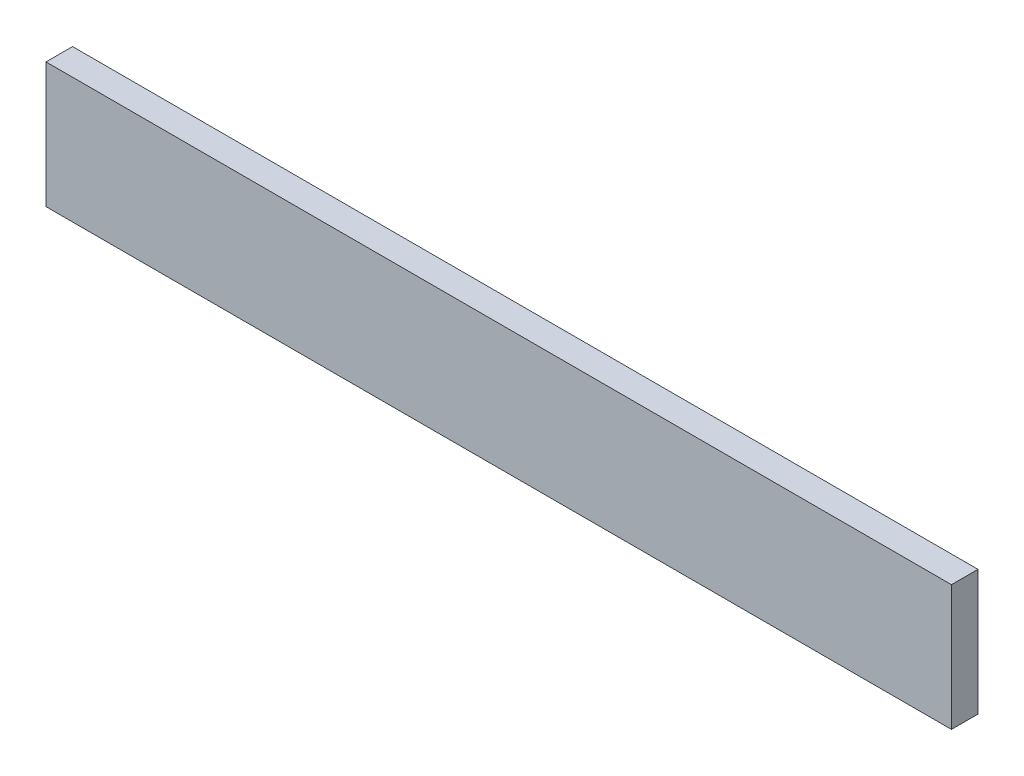
ISO-10303-21;
HEADER;
FILE_DESCRIPTION(('STEP AP214'),'2;1');
FILE_NAME('part.step','',(''),(''),'','','');
FILE_SCHEMA(('AUTOMOTIVE_DESIGN { 1 0 10303 214 1 1 1 1 }'));
ENDSEC;
DATA;
#1=APPLICATION_CONTEXT('core data for automotive mechanical design processes');
#2=APPLICATION_PROTOCOL_DEFINITION('international standard','automotive_design',2000,#1);
#3=PRODUCT_CONTEXT('',#1,'mechanical');
#4=PRODUCT('Part','Part','',(#3));
#5=PRODUCT_RELATED_PRODUCT_CATEGORY('part','',(#4));
#6=PRODUCT_DEFINITION_FORMATION('','',#4);
#7=PRODUCT_DEFINITION_CONTEXT('part definition',#1,'design');
#8=PRODUCT_DEFINITION('design','',#6,#7);
#9=PRODUCT_DEFINITION_SHAPE('','',#8);
#10=(LENGTH_UNIT() NAMED_UNIT(*) SI_UNIT(.MILLI.,.METRE.));
#11=(NAMED_UNIT(*) PLANE_ANGLE_UNIT() SI_UNIT($,.RADIAN.));
#12=(NAMED_UNIT(*) SI_UNIT($,.STERADIAN.) SOLID_ANGLE_UNIT());
#13=UNCERTAINTY_MEASURE_WITH_UNIT(LENGTH_MEASURE(1.E-05),#10,'distance_accuracy_value','');
#14=(GEOMETRIC_REPRESENTATION_CONTEXT(3) GLOBAL_UNCERTAINTY_ASSIGNED_CONTEXT((#13)) GLOBAL_UNIT_ASSIGNED_CONTEXT((#10,
#11,#12)) REPRESENTATION_CONTEXT('',''));
#15=CARTESIAN_POINT('',(0.,0.,0.));
#16=DIRECTION('',(0.,0.,1.));
#17=DIRECTION('',(1.,0.,0.));
#18=AXIS2_PLACEMENT_3D('',#15,#16,#17);
#19=CARTESIAN_POINT('',(-325.,0.,19.05));
#20=DIRECTION('',(1.,0.,0.));
#21=DIRECTION('',(0.,0.,-1.));
#22=AXIS2_PLACEMENT_3D('',#19,#20,#21);
#23=PLANE('',#22);
#24=DIRECTION('',(0.,-1.,0.));
#25=VECTOR('',#24,1.);
#26=CARTESIAN_POINT('',(-325.,0.,0.));
#27=LINE('',#26,#25);
#28=CARTESIAN_POINT('',(-325.,90.,0.));
#29=VERTEX_POINT('',#28);
#30=CARTESIAN_POINT('',(-325.,0.,0.));
#31=VERTEX_POINT('',#30);
#32=EDGE_CURVE('E96',#29,#31,#27,.T.);
#33=ORIENTED_EDGE('',*,*,#32,.T.);
#34=DIRECTION('',(0.,0.,-1.));
#35=VECTOR('',#34,1.);
#36=CARTESIAN_POINT('',(-325.,0.,19.05));
#37=LINE('',#36,#35);
#38=CARTESIAN_POINT('',(-325.,0.,19.05));
#39=VERTEX_POINT('',#38);
#40=EDGE_CURVE('E11',#39,#31,#37,.T.);
#41=ORIENTED_EDGE('',*,*,#40,.F.);
#42=DIRECTION('',(0.,-1.,0.));
#43=VECTOR('',#42,1.);
#44=CARTESIAN_POINT('',(-325.,0.,19.05));
#45=LINE('',#44,#43);
#46=CARTESIAN_POINT('',(-325.,90.,19.05));
#47=VERTEX_POINT('',#46);
#48=EDGE_CURVE('E84',#47,#39,#45,.T.);
#49=ORIENTED_EDGE('',*,*,#48,.F.);
#50=DIRECTION('',(0.,0.,-1.));
#51=VECTOR('',#50,1.);
#52=CARTESIAN_POINT('',(-325.,90.,19.05));
#53=LINE('',#52,#51);
#54=EDGE_CURVE('E92',#47,#29,#53,.T.);
#55=ORIENTED_EDGE('',*,*,#54,.T.);
#56=EDGE_LOOP('',(#33,#41,#49,#55));
#57=FACE_BOUND('',#56,.T.);
#58=ADVANCED_FACE('F33',(#57),#23,.F.);
#59=CARTESIAN_POINT('',(-325.,0.,19.05));
#60=DIRECTION('',(0.,1.,0.));
#61=DIRECTION('',(0.,0.,1.));
#62=AXIS2_PLACEMENT_3D('',#59,#60,#61);
#63=PLANE('',#62);
#64=DIRECTION('',(1.,0.,0.));
#65=VECTOR('',#64,1.);
#66=CARTESIAN_POINT('',(-325.,0.,0.));
#67=LINE('',#66,#65);
#68=CARTESIAN_POINT('',(325.,0.,0.));
#69=VERTEX_POINT('',#68);
#70=EDGE_CURVE('E88',#31,#69,#67,.T.);
#71=ORIENTED_EDGE('',*,*,#70,.T.);
#72=DIRECTION('',(0.,0.,-1.));
#73=VECTOR('',#72,1.);
#74=CARTESIAN_POINT('',(325.,0.,19.05));
#75=LINE('',#74,#73);
#76=CARTESIAN_POINT('',(325.,0.,19.05));
#77=VERTEX_POINT('',#76);
#78=EDGE_CURVE('E41',#77,#69,#75,.T.);
#79=ORIENTED_EDGE('',*,*,#78,.F.);
#80=DIRECTION('',(1.,0.,0.));
#81=VECTOR('',#80,1.);
#82=CARTESIAN_POINT('',(-325.,0.,19.05));
#83=LINE('',#82,#81);
#84=EDGE_CURVE('E79',#39,#77,#83,.T.);
#85=ORIENTED_EDGE('',*,*,#84,.F.);
#86=ORIENTED_EDGE('',*,*,#40,.T.);
#87=EDGE_LOOP('',(#71,#79,#85,#86));
#88=FACE_BOUND('',#87,.T.);
#89=ADVANCED_FACE('F87',(#88),#63,.F.);
#90=CARTESIAN_POINT('',(325.,0.,19.05));
#91=DIRECTION('',(-1.,0.,0.));
#92=DIRECTION('',(0.,0.,1.));
#93=AXIS2_PLACEMENT_3D('',#90,#91,#92);
#94=PLANE('',#93);
#95=DIRECTION('',(0.,1.,0.));
#96=VECTOR('',#95,1.);
#97=CARTESIAN_POINT('',(325.,0.,0.));
#98=LINE('',#97,#96);
#99=CARTESIAN_POINT('',(325.,90.,0.));
#100=VERTEX_POINT('',#99);
#101=EDGE_CURVE('E66',#69,#100,#98,.T.);
#102=ORIENTED_EDGE('',*,*,#101,.T.);
#103=DIRECTION('',(0.,0.,-1.));
#104=VECTOR('',#103,1.);
#105=CARTESIAN_POINT('',(325.,90.,19.05));
#106=LINE('',#105,#104);
#107=CARTESIAN_POINT('',(325.,90.,19.05));
#108=VERTEX_POINT('',#107);
#109=EDGE_CURVE('E89',#108,#100,#106,.T.);
#110=ORIENTED_EDGE('',*,*,#109,.F.);
#111=DIRECTION('',(0.,1.,0.));
#112=VECTOR('',#111,1.);
#113=CARTESIAN_POINT('',(325.,0.,19.05));
#114=LINE('',#113,#112);
#115=EDGE_CURVE('E82',#77,#108,#114,.T.);
#116=ORIENTED_EDGE('',*,*,#115,.F.);
#117=ORIENTED_EDGE('',*,*,#78,.T.);
#118=EDGE_LOOP('',(#102,#110,#116,#117));
#119=FACE_BOUND('',#118,.T.);
#120=ADVANCED_FACE('F90',(#119),#94,.F.);
#121=CARTESIAN_POINT('',(-325.,90.,19.05));
#122=DIRECTION('',(0.,-1.,0.));
#123=DIRECTION('',(0.,0.,-1.));
#124=AXIS2_PLACEMENT_3D('',#121,#122,#123);
#125=PLANE('',#124);
#126=DIRECTION('',(-1.,0.,0.));
#127=VECTOR('',#126,1.);
#128=CARTESIAN_POINT('',(-325.,90.,0.));
#129=LINE('',#128,#127);
#130=EDGE_CURVE('E72',#100,#29,#129,.T.);
#131=ORIENTED_EDGE('',*,*,#130,.T.);
#132=ORIENTED_EDGE('',*,*,#54,.F.);
#133=DIRECTION('',(-1.,0.,0.));
#134=VECTOR('',#133,1.);
#135=CARTESIAN_POINT('',(-325.,90.,19.05));
#136=LINE('',#135,#134);
#137=EDGE_CURVE('E49',#108,#47,#136,.T.);
#138=ORIENTED_EDGE('',*,*,#137,.F.);
#139=ORIENTED_EDGE('',*,*,#109,.T.);
#140=EDGE_LOOP('',(#131,#132,#138,#139));
#141=FACE_BOUND('',#140,.T.);
#142=ADVANCED_FACE('F103',(#141),#125,.F.);
#143=CARTESIAN_POINT('',(0.,0.,19.05));
#144=DIRECTION('',(0.,0.,-1.));
#145=DIRECTION('',(-1.,0.,0.));
#146=AXIS2_PLACEMENT_3D('',#143,#144,#145);
#147=PLANE('',#146);
#148=ORIENTED_EDGE('',*,*,#48,.T.);
#149=ORIENTED_EDGE('',*,*,#84,.T.);
#150=ORIENTED_EDGE('',*,*,#115,.T.);
#151=ORIENTED_EDGE('',*,*,#137,.T.);
#152=EDGE_LOOP('',(#148,#149,#150,#151));
#153=FACE_BOUND('',#152,.T.);
#154=ADVANCED_FACE('F80',(#153),#147,.F.);
#155=CARTESIAN_POINT('',(0.,0.,0.));
#156=DIRECTION('',(0.,0.,-1.));
#157=DIRECTION('',(-1.,0.,0.));
#158=AXIS2_PLACEMENT_3D('',#155,#156,#157);
#159=PLANE('',#158);
#160=ORIENTED_EDGE('',*,*,#32,.F.);
#161=ORIENTED_EDGE('',*,*,#130,.F.);
#162=ORIENTED_EDGE('',*,*,#101,.F.);
#163=ORIENTED_EDGE('',*,*,#70,.F.);
#164=EDGE_LOOP('',(#160,#161,#162,#163));
#165=FACE_BOUND('',#164,.T.);
#166=ADVANCED_FACE('F106',(#165),#159,.T.);
#167=CLOSED_SHELL('',(#58,#89,#120,#142,#154,#166));
#168=MANIFOLD_SOLID_BREP('B2',#167);
#169=ADVANCED_BREP_SHAPE_REPRESENTATION('',(#18,#168),#14);
#170=SHAPE_DEFINITION_REPRESENTATION(#9,#169);
ENDSEC;
END-ISO-10303-21;
